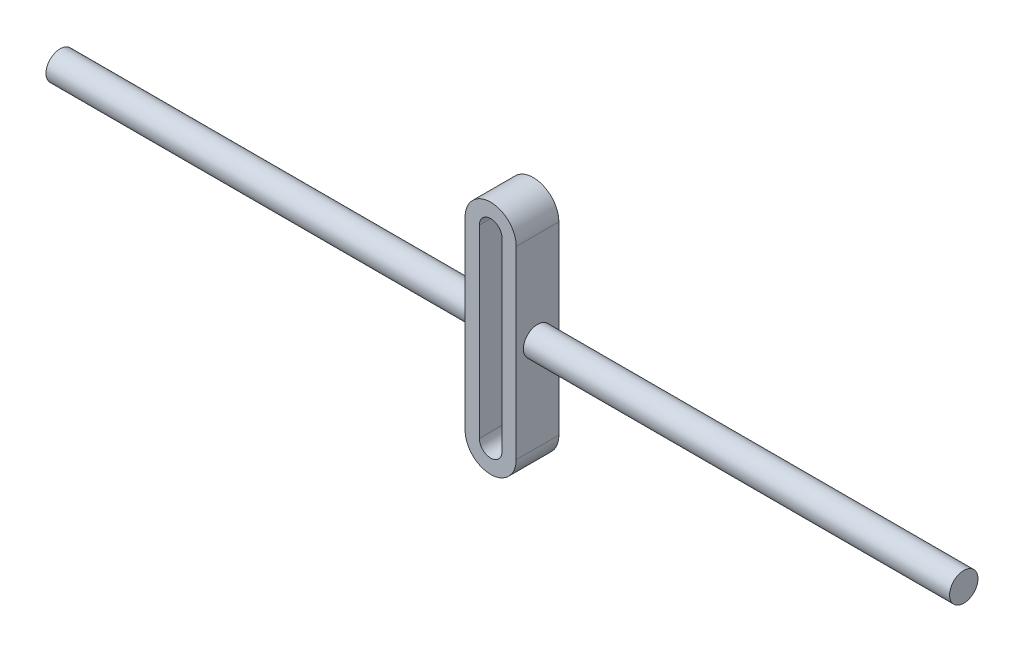
ISO-10303-21;
HEADER;
FILE_DESCRIPTION(('STEP AP214'),'2;1');
FILE_NAME('part.step','',(''),(''),'','','');
FILE_SCHEMA(('AUTOMOTIVE_DESIGN { 1 0 10303 214 1 1 1 1 }'));
ENDSEC;
DATA;
#1=APPLICATION_CONTEXT('core data for automotive mechanical design processes');
#2=APPLICATION_PROTOCOL_DEFINITION('international standard','automotive_design',2000,#1);
#3=PRODUCT_CONTEXT('',#1,'mechanical');
#4=PRODUCT('Part','Part','',(#3));
#5=PRODUCT_RELATED_PRODUCT_CATEGORY('part','',(#4));
#6=PRODUCT_DEFINITION_FORMATION('','',#4);
#7=PRODUCT_DEFINITION_CONTEXT('part definition',#1,'design');
#8=PRODUCT_DEFINITION('design','',#6,#7);
#9=PRODUCT_DEFINITION_SHAPE('','',#8);
#10=(LENGTH_UNIT() NAMED_UNIT(*) SI_UNIT(.MILLI.,.METRE.));
#11=(NAMED_UNIT(*) PLANE_ANGLE_UNIT() SI_UNIT($,.RADIAN.));
#12=(NAMED_UNIT(*) SI_UNIT($,.STERADIAN.) SOLID_ANGLE_UNIT());
#13=UNCERTAINTY_MEASURE_WITH_UNIT(LENGTH_MEASURE(1.E-05),#10,'distance_accuracy_value','');
#14=(GEOMETRIC_REPRESENTATION_CONTEXT(3) GLOBAL_UNCERTAINTY_ASSIGNED_CONTEXT((#13)) GLOBAL_UNIT_ASSIGNED_CONTEXT((#10,
#11,#12)) REPRESENTATION_CONTEXT('',''));
#15=CARTESIAN_POINT('',(0.,0.,0.));
#16=DIRECTION('',(0.,0.,1.));
#17=DIRECTION('',(1.,0.,0.));
#18=AXIS2_PLACEMENT_3D('',#15,#16,#17);
#19=CARTESIAN_POINT('',(0.,0.,15.));
#20=DIRECTION('',(0.,0.,1.));
#21=DIRECTION('',(1.,0.,0.));
#22=AXIS2_PLACEMENT_3D('',#19,#20,#21);
#23=PLANE('',#22);
#24=CARTESIAN_POINT('',(0.,0.,15.));
#25=DIRECTION('',(0.,0.,1.));
#26=DIRECTION('',(1.,0.,0.));
#27=AXIS2_PLACEMENT_3D('',#24,#25,#26);
#28=CIRCLE('',#27,9.);
#29=CARTESIAN_POINT('',(-9.,0.,15.));
#30=VERTEX_POINT('',#29);
#31=CARTESIAN_POINT('',(9.,0.,15.));
#32=VERTEX_POINT('',#31);
#33=EDGE_CURVE('E155',#30,#32,#28,.T.);
#34=ORIENTED_EDGE('',*,*,#33,.T.);
#35=DIRECTION('',(0.,1.,0.));
#36=VECTOR('',#35,1.);
#37=CARTESIAN_POINT('',(9.,0.,15.));
#38=LINE('',#37,#36);
#39=CARTESIAN_POINT('',(9.,65.,15.));
#40=VERTEX_POINT('',#39);
#41=EDGE_CURVE('E159',#32,#40,#38,.T.);
#42=ORIENTED_EDGE('',*,*,#41,.T.);
#43=CARTESIAN_POINT('',(0.,65.,15.));
#44=DIRECTION('',(0.,0.,1.));
#45=DIRECTION('',(1.,0.,0.));
#46=AXIS2_PLACEMENT_3D('',#43,#44,#45);
#47=CIRCLE('',#46,9.);
#48=CARTESIAN_POINT('',(-9.,65.,15.));
#49=VERTEX_POINT('',#48);
#50=EDGE_CURVE('E163',#40,#49,#47,.T.);
#51=ORIENTED_EDGE('',*,*,#50,.T.);
#52=DIRECTION('',(0.,-1.,0.));
#53=VECTOR('',#52,1.);
#54=CARTESIAN_POINT('',(-9.,0.,15.));
#55=LINE('',#54,#53);
#56=EDGE_CURVE('E166',#49,#30,#55,.T.);
#57=ORIENTED_EDGE('',*,*,#56,.T.);
#58=EDGE_LOOP('',(#34,#42,#51,#57));
#59=FACE_BOUND('',#58,.T.);
#60=DIRECTION('',(0.,1.,0.));
#61=VECTOR('',#60,1.);
#62=CARTESIAN_POINT('',(4.,0.,15.));
#63=LINE('',#62,#61);
#64=CARTESIAN_POINT('',(4.,0.,15.));
#65=VERTEX_POINT('',#64);
#66=CARTESIAN_POINT('',(4.,65.,15.));
#67=VERTEX_POINT('',#66);
#68=EDGE_CURVE('E114',#65,#67,#63,.T.);
#69=ORIENTED_EDGE('',*,*,#68,.F.);
#70=CARTESIAN_POINT('',(0.,0.,15.));
#71=DIRECTION('',(0.,0.,1.));
#72=DIRECTION('',(1.,0.,0.));
#73=AXIS2_PLACEMENT_3D('',#70,#71,#72);
#74=CIRCLE('',#73,4.);
#75=CARTESIAN_POINT('',(-4.,0.,15.));
#76=VERTEX_POINT('',#75);
#77=EDGE_CURVE('E105',#76,#65,#74,.T.);
#78=ORIENTED_EDGE('',*,*,#77,.F.);
#79=DIRECTION('',(0.,-1.,0.));
#80=VECTOR('',#79,1.);
#81=CARTESIAN_POINT('',(-4.,0.,15.));
#82=LINE('',#81,#80);
#83=CARTESIAN_POINT('',(-4.,65.,15.));
#84=VERTEX_POINT('',#83);
#85=EDGE_CURVE('E131',#84,#76,#82,.T.);
#86=ORIENTED_EDGE('',*,*,#85,.F.);
#87=CARTESIAN_POINT('',(0.,65.,15.));
#88=DIRECTION('',(0.,0.,1.));
#89=DIRECTION('',(1.,0.,0.));
#90=AXIS2_PLACEMENT_3D('',#87,#88,#89);
#91=CIRCLE('',#90,4.);
#92=EDGE_CURVE('E127',#67,#84,#91,.T.);
#93=ORIENTED_EDGE('',*,*,#92,.F.);
#94=EDGE_LOOP('',(#69,#78,#86,#93));
#95=FACE_BOUND('',#94,.T.);
#96=ADVANCED_FACE('F39',(#59,#95),#23,.T.);
#97=CARTESIAN_POINT('',(0.,0.,0.));
#98=DIRECTION('',(0.,0.,1.));
#99=DIRECTION('',(1.,0.,0.));
#100=AXIS2_PLACEMENT_3D('',#97,#98,#99);
#101=PLANE('',#100);
#102=CARTESIAN_POINT('',(0.,0.,0.));
#103=DIRECTION('',(0.,0.,1.));
#104=DIRECTION('',(1.,0.,0.));
#105=AXIS2_PLACEMENT_3D('',#102,#103,#104);
#106=CIRCLE('',#105,9.);
#107=CARTESIAN_POINT('',(-9.,0.,0.));
#108=VERTEX_POINT('',#107);
#109=CARTESIAN_POINT('',(9.,0.,0.));
#110=VERTEX_POINT('',#109);
#111=EDGE_CURVE('E123',#108,#110,#106,.T.);
#112=ORIENTED_EDGE('',*,*,#111,.F.);
#113=DIRECTION('',(0.,-1.,0.));
#114=VECTOR('',#113,1.);
#115=CARTESIAN_POINT('',(-9.,0.,0.));
#116=LINE('',#115,#114);
#117=CARTESIAN_POINT('',(-9.,65.,0.));
#118=VERTEX_POINT('',#117);
#119=EDGE_CURVE('E160',#118,#108,#116,.T.);
#120=ORIENTED_EDGE('',*,*,#119,.F.);
#121=CARTESIAN_POINT('',(0.,65.,0.));
#122=DIRECTION('',(0.,0.,1.));
#123=DIRECTION('',(1.,0.,0.));
#124=AXIS2_PLACEMENT_3D('',#121,#122,#123);
#125=CIRCLE('',#124,9.);
#126=CARTESIAN_POINT('',(9.,65.,0.));
#127=VERTEX_POINT('',#126);
#128=EDGE_CURVE('E176',#127,#118,#125,.T.);
#129=ORIENTED_EDGE('',*,*,#128,.F.);
#130=DIRECTION('',(0.,1.,0.));
#131=VECTOR('',#130,1.);
#132=CARTESIAN_POINT('',(9.,0.,0.));
#133=LINE('',#132,#131);
#134=EDGE_CURVE('E173',#110,#127,#133,.T.);
#135=ORIENTED_EDGE('',*,*,#134,.F.);
#136=EDGE_LOOP('',(#112,#120,#129,#135));
#137=FACE_BOUND('',#136,.T.);
#138=CARTESIAN_POINT('',(0.,0.,0.));
#139=DIRECTION('',(0.,0.,1.));
#140=DIRECTION('',(1.,0.,0.));
#141=AXIS2_PLACEMENT_3D('',#138,#139,#140);
#142=CIRCLE('',#141,4.);
#143=CARTESIAN_POINT('',(-4.,0.,0.));
#144=VERTEX_POINT('',#143);
#145=CARTESIAN_POINT('',(4.,0.,0.));
#146=VERTEX_POINT('',#145);
#147=EDGE_CURVE('E63',#144,#146,#142,.T.);
#148=ORIENTED_EDGE('',*,*,#147,.T.);
#149=DIRECTION('',(0.,1.,0.));
#150=VECTOR('',#149,1.);
#151=CARTESIAN_POINT('',(4.,0.,0.));
#152=LINE('',#151,#150);
#153=CARTESIAN_POINT('',(4.,65.,0.));
#154=VERTEX_POINT('',#153);
#155=EDGE_CURVE('E121',#146,#154,#152,.T.);
#156=ORIENTED_EDGE('',*,*,#155,.T.);
#157=CARTESIAN_POINT('',(0.,65.,0.));
#158=DIRECTION('',(0.,0.,1.));
#159=DIRECTION('',(1.,0.,0.));
#160=AXIS2_PLACEMENT_3D('',#157,#158,#159);
#161=CIRCLE('',#160,4.);
#162=CARTESIAN_POINT('',(-4.,65.,0.));
#163=VERTEX_POINT('',#162);
#164=EDGE_CURVE('E142',#154,#163,#161,.T.);
#165=ORIENTED_EDGE('',*,*,#164,.T.);
#166=DIRECTION('',(0.,-1.,0.));
#167=VECTOR('',#166,1.);
#168=CARTESIAN_POINT('',(-4.,0.,0.));
#169=LINE('',#168,#167);
#170=EDGE_CURVE('E115',#163,#144,#169,.T.);
#171=ORIENTED_EDGE('',*,*,#170,.T.);
#172=EDGE_LOOP('',(#148,#156,#165,#171));
#173=FACE_BOUND('',#172,.T.);
#174=ADVANCED_FACE('F203',(#137,#173),#101,.F.);
#175=CARTESIAN_POINT('',(0.,0.,15.));
#176=DIRECTION('',(0.,0.,-1.));
#177=DIRECTION('',(-1.,0.,0.));
#178=AXIS2_PLACEMENT_3D('',#175,#176,#177);
#179=CYLINDRICAL_SURFACE('',#178,9.);
#180=ORIENTED_EDGE('',*,*,#111,.T.);
#181=DIRECTION('',(0.,0.,-1.));
#182=VECTOR('',#181,1.);
#183=CARTESIAN_POINT('',(9.,0.,15.));
#184=LINE('',#183,#182);
#185=EDGE_CURVE('E48',#32,#110,#184,.T.);
#186=ORIENTED_EDGE('',*,*,#185,.F.);
#187=ORIENTED_EDGE('',*,*,#33,.F.);
#188=DIRECTION('',(0.,0.,-1.));
#189=VECTOR('',#188,1.);
#190=CARTESIAN_POINT('',(-9.,0.,15.));
#191=LINE('',#190,#189);
#192=EDGE_CURVE('E169',#30,#108,#191,.T.);
#193=ORIENTED_EDGE('',*,*,#192,.T.);
#194=EDGE_LOOP('',(#180,#186,#187,#193));
#195=FACE_BOUND('',#194,.T.);
#196=ADVANCED_FACE('F41',(#195),#179,.T.);
#197=CARTESIAN_POINT('',(9.,0.,15.));
#198=DIRECTION('',(-1.,0.,0.));
#199=DIRECTION('',(0.,0.,1.));
#200=AXIS2_PLACEMENT_3D('',#197,#198,#199);
#201=PLANE('',#200);
#202=CARTESIAN_POINT('',(9.00000000000001,32.5,7.5));
#203=DIRECTION('',(-1.,0.,0.));
#204=DIRECTION('',(0.,0.,1.));
#205=AXIS2_PLACEMENT_3D('',#202,#203,#204);
#206=CIRCLE('',#205,5.);
#207=CARTESIAN_POINT('',(9.00000000000001,32.5,12.5));
#208=VERTEX_POINT('',#207);
#209=EDGE_CURVE('E11',#208,#208,#206,.F.);
#210=ORIENTED_EDGE('',*,*,#209,.F.);
#211=EDGE_LOOP('',(#210));
#212=FACE_BOUND('',#211,.T.);
#213=ORIENTED_EDGE('',*,*,#134,.T.);
#214=DIRECTION('',(0.,0.,-1.));
#215=VECTOR('',#214,1.);
#216=CARTESIAN_POINT('',(9.,65.,15.));
#217=LINE('',#216,#215);
#218=EDGE_CURVE('E188',#40,#127,#217,.T.);
#219=ORIENTED_EDGE('',*,*,#218,.F.);
#220=ORIENTED_EDGE('',*,*,#41,.F.);
#221=ORIENTED_EDGE('',*,*,#185,.T.);
#222=EDGE_LOOP('',(#213,#219,#220,#221));
#223=FACE_BOUND('',#222,.T.);
#224=ADVANCED_FACE('F195',(#212,#223),#201,.F.);
#225=CARTESIAN_POINT('',(0.,65.,15.));
#226=DIRECTION('',(0.,0.,-1.));
#227=DIRECTION('',(-1.,0.,0.));
#228=AXIS2_PLACEMENT_3D('',#225,#226,#227);
#229=CYLINDRICAL_SURFACE('',#228,9.);
#230=ORIENTED_EDGE('',*,*,#128,.T.);
#231=DIRECTION('',(0.,0.,-1.));
#232=VECTOR('',#231,1.);
#233=CARTESIAN_POINT('',(-9.,65.,15.));
#234=LINE('',#233,#232);
#235=EDGE_CURVE('E184',#49,#118,#234,.T.);
#236=ORIENTED_EDGE('',*,*,#235,.F.);
#237=ORIENTED_EDGE('',*,*,#50,.F.);
#238=ORIENTED_EDGE('',*,*,#218,.T.);
#239=EDGE_LOOP('',(#230,#236,#237,#238));
#240=FACE_BOUND('',#239,.T.);
#241=ADVANCED_FACE('F208',(#240),#229,.T.);
#242=CARTESIAN_POINT('',(-9.,0.,15.));
#243=DIRECTION('',(1.,0.,0.));
#244=DIRECTION('',(0.,0.,-1.));
#245=AXIS2_PLACEMENT_3D('',#242,#243,#244);
#246=PLANE('',#245);
#247=CARTESIAN_POINT('',(-9.,32.5,7.5));
#248=DIRECTION('',(1.,0.,0.));
#249=DIRECTION('',(0.,0.,-1.));
#250=AXIS2_PLACEMENT_3D('',#247,#248,#249);
#251=CIRCLE('',#250,5.);
#252=CARTESIAN_POINT('',(-9.,32.5,2.5));
#253=VERTEX_POINT('',#252);
#254=EDGE_CURVE('E328',#253,#253,#251,.T.);
#255=ORIENTED_EDGE('',*,*,#254,.T.);
#256=EDGE_LOOP('',(#255));
#257=FACE_BOUND('',#256,.T.);
#258=ORIENTED_EDGE('',*,*,#119,.T.);
#259=ORIENTED_EDGE('',*,*,#192,.F.);
#260=ORIENTED_EDGE('',*,*,#56,.F.);
#261=ORIENTED_EDGE('',*,*,#235,.T.);
#262=EDGE_LOOP('',(#258,#259,#260,#261));
#263=FACE_BOUND('',#262,.T.);
#264=ADVANCED_FACE('F212',(#257,#263),#246,.F.);
#265=CARTESIAN_POINT('',(0.,0.,15.));
#266=DIRECTION('',(0.,0.,-1.));
#267=DIRECTION('',(-1.,0.,0.));
#268=AXIS2_PLACEMENT_3D('',#265,#266,#267);
#269=CYLINDRICAL_SURFACE('',#268,4.);
#270=ORIENTED_EDGE('',*,*,#147,.F.);
#271=DIRECTION('',(0.,0.,-1.));
#272=VECTOR('',#271,1.);
#273=CARTESIAN_POINT('',(-4.,0.,15.));
#274=LINE('',#273,#272);
#275=EDGE_CURVE('E109',#76,#144,#274,.T.);
#276=ORIENTED_EDGE('',*,*,#275,.F.);
#277=ORIENTED_EDGE('',*,*,#77,.T.);
#278=DIRECTION('',(0.,0.,-1.));
#279=VECTOR('',#278,1.);
#280=CARTESIAN_POINT('',(4.,0.,15.));
#281=LINE('',#280,#279);
#282=EDGE_CURVE('E108',#65,#146,#281,.T.);
#283=ORIENTED_EDGE('',*,*,#282,.T.);
#284=EDGE_LOOP('',(#270,#276,#277,#283));
#285=FACE_BOUND('',#284,.T.);
#286=ADVANCED_FACE('F107',(#285),#269,.F.);
#287=CARTESIAN_POINT('',(4.,0.,15.));
#288=DIRECTION('',(-1.,0.,0.));
#289=DIRECTION('',(0.,-1.,0.));
#290=AXIS2_PLACEMENT_3D('',#287,#288,#289);
#291=PLANE('',#290);
#292=ORIENTED_EDGE('',*,*,#155,.F.);
#293=ORIENTED_EDGE('',*,*,#282,.F.);
#294=ORIENTED_EDGE('',*,*,#68,.T.);
#295=DIRECTION('',(0.,0.,-1.));
#296=VECTOR('',#295,1.);
#297=CARTESIAN_POINT('',(4.,65.,15.));
#298=LINE('',#297,#296);
#299=EDGE_CURVE('E124',#67,#154,#298,.T.);
#300=ORIENTED_EDGE('',*,*,#299,.T.);
#301=EDGE_LOOP('',(#292,#293,#294,#300));
#302=FACE_BOUND('',#301,.T.);
#303=ADVANCED_FACE('F118',(#302),#291,.T.);
#304=CARTESIAN_POINT('',(0.,65.,15.));
#305=DIRECTION('',(0.,0.,-1.));
#306=DIRECTION('',(-1.,0.,0.));
#307=AXIS2_PLACEMENT_3D('',#304,#305,#306);
#308=CYLINDRICAL_SURFACE('',#307,4.);
#309=ORIENTED_EDGE('',*,*,#164,.F.);
#310=ORIENTED_EDGE('',*,*,#299,.F.);
#311=ORIENTED_EDGE('',*,*,#92,.T.);
#312=DIRECTION('',(0.,0.,-1.));
#313=VECTOR('',#312,1.);
#314=CARTESIAN_POINT('',(-4.,65.,15.));
#315=LINE('',#314,#313);
#316=EDGE_CURVE('E55',#84,#163,#315,.T.);
#317=ORIENTED_EDGE('',*,*,#316,.T.);
#318=EDGE_LOOP('',(#309,#310,#311,#317));
#319=FACE_BOUND('',#318,.T.);
#320=ADVANCED_FACE('F247',(#319),#308,.F.);
#321=CARTESIAN_POINT('',(-4.,0.,15.));
#322=DIRECTION('',(1.,0.,0.));
#323=DIRECTION('',(0.,0.,-1.));
#324=AXIS2_PLACEMENT_3D('',#321,#322,#323);
#325=PLANE('',#324);
#326=ORIENTED_EDGE('',*,*,#170,.F.);
#327=ORIENTED_EDGE('',*,*,#316,.F.);
#328=ORIENTED_EDGE('',*,*,#85,.T.);
#329=ORIENTED_EDGE('',*,*,#275,.T.);
#330=EDGE_LOOP('',(#326,#327,#328,#329));
#331=FACE_BOUND('',#330,.T.);
#332=ADVANCED_FACE('F237',(#331),#325,.T.);
#333=CARTESIAN_POINT('',(159.,32.5,7.5));
#334=DIRECTION('',(-1.,0.,0.));
#335=DIRECTION('',(0.,0.,1.));
#336=AXIS2_PLACEMENT_3D('',#333,#334,#335);
#337=CYLINDRICAL_SURFACE('',#336,5.);
#338=CARTESIAN_POINT('',(159.,32.5,7.5));
#339=DIRECTION('',(1.,0.,0.));
#340=DIRECTION('',(0.,0.,-1.));
#341=AXIS2_PLACEMENT_3D('',#338,#339,#340);
#342=CIRCLE('',#341,5.);
#343=CARTESIAN_POINT('',(159.,32.5,2.5));
#344=VERTEX_POINT('',#343);
#345=EDGE_CURVE('E139',#344,#344,#342,.T.);
#346=ORIENTED_EDGE('',*,*,#345,.F.);
#347=EDGE_LOOP('',(#346));
#348=FACE_BOUND('',#347,.T.);
#349=ORIENTED_EDGE('',*,*,#209,.T.);
#350=EDGE_LOOP('',(#349));
#351=FACE_BOUND('',#350,.T.);
#352=ADVANCED_FACE('F234',(#348,#351),#337,.T.);
#353=CARTESIAN_POINT('',(159.,32.5,7.5));
#354=DIRECTION('',(1.,0.,0.));
#355=DIRECTION('',(0.,0.,-1.));
#356=AXIS2_PLACEMENT_3D('',#353,#354,#355);
#357=PLANE('',#356);
#358=ORIENTED_EDGE('',*,*,#345,.T.);
#359=EDGE_LOOP('',(#358));
#360=FACE_BOUND('',#359,.T.);
#361=ADVANCED_FACE('F236',(#360),#357,.T.);
#362=CARTESIAN_POINT('',(-159.,32.5,7.5));
#363=DIRECTION('',(1.,0.,0.));
#364=DIRECTION('',(0.,0.,-1.));
#365=AXIS2_PLACEMENT_3D('',#362,#363,#364);
#366=CYLINDRICAL_SURFACE('',#365,5.);
#367=CARTESIAN_POINT('',(-159.,32.5,7.5));
#368=DIRECTION('',(1.,0.,0.));
#369=DIRECTION('',(0.,0.,-1.));
#370=AXIS2_PLACEMENT_3D('',#367,#368,#369);
#371=CIRCLE('',#370,5.);
#372=CARTESIAN_POINT('',(-159.,32.5,2.5));
#373=VERTEX_POINT('',#372);
#374=EDGE_CURVE('E326',#373,#373,#371,.T.);
#375=ORIENTED_EDGE('',*,*,#374,.T.);
#376=EDGE_LOOP('',(#375));
#377=FACE_BOUND('',#376,.T.);
#378=ORIENTED_EDGE('',*,*,#254,.F.);
#379=EDGE_LOOP('',(#378));
#380=FACE_BOUND('',#379,.T.);
#381=ADVANCED_FACE('F244',(#377,#380),#366,.T.);
#382=CARTESIAN_POINT('',(-159.,32.5,7.5));
#383=DIRECTION('',(-1.,0.,0.));
#384=DIRECTION('',(0.,0.,-1.));
#385=AXIS2_PLACEMENT_3D('',#382,#383,#384);
#386=PLANE('',#385);
#387=ORIENTED_EDGE('',*,*,#374,.F.);
#388=EDGE_LOOP('',(#387));
#389=FACE_BOUND('',#388,.T.);
#390=ADVANCED_FACE('F311',(#389),#386,.T.);
#391=CLOSED_SHELL('',(#96,#174,#196,#224,#241,#264,#286,#303,#320,#332,#352,#361,#381,#390));
#392=MANIFOLD_SOLID_BREP('B2',#391);
#393=ADVANCED_BREP_SHAPE_REPRESENTATION('',(#18,#392),#14);
#394=SHAPE_DEFINITION_REPRESENTATION(#9,#393);
ENDSEC;
END-ISO-10303-21;
